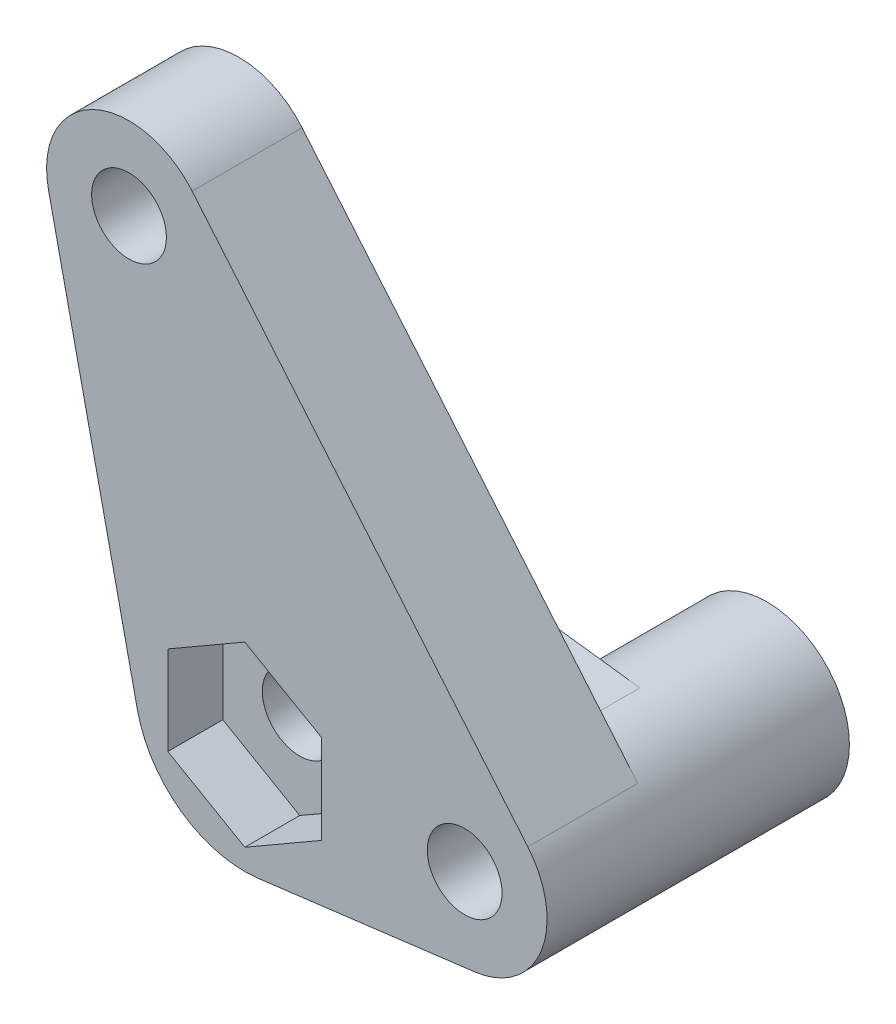
ISO-10303-21;
HEADER;
FILE_DESCRIPTION(('STEP AP214'),'2;1');
FILE_NAME('part.step','',(''),(''),'','','');
FILE_SCHEMA(('AUTOMOTIVE_DESIGN { 1 0 10303 214 1 1 1 1 }'));
ENDSEC;
DATA;
#1=APPLICATION_CONTEXT('core data for automotive mechanical design processes');
#2=APPLICATION_PROTOCOL_DEFINITION('international standard','automotive_design',2000,#1);
#3=PRODUCT_CONTEXT('',#1,'mechanical');
#4=PRODUCT('Part','Part','',(#3));
#5=PRODUCT_RELATED_PRODUCT_CATEGORY('part','',(#4));
#6=PRODUCT_DEFINITION_FORMATION('','',#4);
#7=PRODUCT_DEFINITION_CONTEXT('part definition',#1,'design');
#8=PRODUCT_DEFINITION('design','',#6,#7);
#9=PRODUCT_DEFINITION_SHAPE('','',#8);
#10=(LENGTH_UNIT() NAMED_UNIT(*) SI_UNIT(.MILLI.,.METRE.));
#11=(NAMED_UNIT(*) PLANE_ANGLE_UNIT() SI_UNIT($,.RADIAN.));
#12=(NAMED_UNIT(*) SI_UNIT($,.STERADIAN.) SOLID_ANGLE_UNIT());
#13=UNCERTAINTY_MEASURE_WITH_UNIT(LENGTH_MEASURE(1.E-05),#10,'distance_accuracy_value','');
#14=(GEOMETRIC_REPRESENTATION_CONTEXT(3) GLOBAL_UNCERTAINTY_ASSIGNED_CONTEXT((#13)) GLOBAL_UNIT_ASSIGNED_CONTEXT((#10,
#11,#12)) REPRESENTATION_CONTEXT('',''));
#15=CARTESIAN_POINT('',(0.,0.,0.));
#16=DIRECTION('',(0.,0.,1.));
#17=DIRECTION('',(1.,0.,0.));
#18=AXIS2_PLACEMENT_3D('',#15,#16,#17);
#19=CARTESIAN_POINT('',(0.,0.,-3.175));
#20=DIRECTION('',(0.,0.,-1.));
#21=DIRECTION('',(1.,0.,0.));
#22=AXIS2_PLACEMENT_3D('',#19,#20,#21);
#23=PLANE('',#22);
#24=CARTESIAN_POINT('',(-19.3880812771702,23.1058155155762,-3.175));
#25=DIRECTION('',(0.,0.,1.));
#26=DIRECTION('',(1.,0.,0.));
#27=AXIS2_PLACEMENT_3D('',#24,#25,#26);
#28=CIRCLE('',#27,2.15899999999999);
#29=CARTESIAN_POINT('',(-17.2290812771702,23.1058155155762,-3.175));
#30=VERTEX_POINT('',#29);
#31=EDGE_CURVE('E236',#30,#30,#28,.T.);
#32=ORIENTED_EDGE('',*,*,#31,.T.);
#33=EDGE_LOOP('',(#32));
#34=FACE_BOUND('',#33,.T.);
#35=DIRECTION('',(0.214040632784061,-0.976824757833972,0.));
#36=VECTOR('',#35,1.);
#37=CARTESIAN_POINT('',(-24.0402091863545,22.0864470019421,-3.175));
#38=LINE('',#37,#36);
#39=CARTESIAN_POINT('',(-24.0402091863545,22.0864470019421,-3.175));
#40=VERTEX_POINT('',#39);
#41=CARTESIAN_POINT('',(-18.9028372122457,-1.35915801817878,-3.175));
#42=VERTEX_POINT('',#41);
#43=EDGE_CURVE('E248',#40,#42,#38,.T.);
#44=ORIENTED_EDGE('',*,*,#43,.F.);
#45=CARTESIAN_POINT('',(-19.3880812771702,23.1058155155762,-3.175));
#46=DIRECTION('',(0.,0.,1.));
#47=DIRECTION('',(1.,0.,0.));
#48=AXIS2_PLACEMENT_3D('',#45,#46,#47);
#49=CIRCLE('',#48,4.76250000000001);
#50=CARTESIAN_POINT('',(-15.739794616816,26.1670915067084,-3.175));
#51=VERTEX_POINT('',#50);
#52=EDGE_CURVE('E245',#51,#40,#49,.T.);
#53=ORIENTED_EDGE('',*,*,#52,.F.);
#54=DIRECTION('',(-0.642787609686538,0.76604444311898,0.));
#55=VECTOR('',#54,1.);
#56=CARTESIAN_POINT('',(3.64828666035414,3.06127599113214,-3.175));
#57=LINE('',#56,#55);
#58=CARTESIAN_POINT('',(3.64828666035414,3.06127599113214,-3.175));
#59=VERTEX_POINT('',#58);
#60=EDGE_CURVE('E242',#59,#51,#57,.T.);
#61=ORIENTED_EDGE('',*,*,#60,.F.);
#62=CARTESIAN_POINT('',(0.,0.,-3.175));
#63=DIRECTION('',(0.,0.,1.));
#64=DIRECTION('',(1.,0.,0.));
#65=AXIS2_PLACEMENT_3D('',#62,#63,#64);
#66=CIRCLE('',#65,4.7625);
#67=CARTESIAN_POINT('',(0.595312499999999,4.72514648210442,-3.175));
#68=VERTEX_POINT('',#67);
#69=EDGE_CURVE('E226',#59,#68,#66,.T.);
#70=ORIENTED_EDGE('',*,*,#69,.T.);
#71=DIRECTION('',(-0.992156741649221,0.125,0.));
#72=VECTOR('',#71,1.);
#73=CARTESIAN_POINT('',(-11.90625,6.30019530947255,-3.175));
#74=LINE('',#73,#72);
#75=CARTESIAN_POINT('',(-11.90625,6.30019530947255,-3.175));
#76=VERTEX_POINT('',#75);
#77=EDGE_CURVE('E164',#68,#76,#74,.T.);
#78=ORIENTED_EDGE('',*,*,#77,.T.);
#79=CARTESIAN_POINT('',(-12.7,0.,-3.175));
#80=DIRECTION('',(0.,0.,1.));
#81=DIRECTION('',(1.,0.,0.));
#82=AXIS2_PLACEMENT_3D('',#79,#80,#81);
#83=CIRCLE('',#82,6.35);
#84=EDGE_CURVE('E167',#76,#42,#83,.T.);
#85=ORIENTED_EDGE('',*,*,#84,.T.);
#86=EDGE_LOOP('',(#44,#53,#61,#70,#78,#85));
#87=FACE_BOUND('',#86,.T.);
#88=ADVANCED_FACE('F43',(#34,#87),#23,.T.);
#89=CARTESIAN_POINT('',(-12.7,0.,-3.175));
#90=DIRECTION('',(0.,0.,1.));
#91=DIRECTION('',(-1.,0.,0.));
#92=AXIS2_PLACEMENT_3D('',#89,#90,#91);
#93=CYLINDRICAL_SURFACE('',#92,2.159);
#94=CARTESIAN_POINT('',(-12.7,0.,0.));
#95=DIRECTION('',(0.,0.,-1.));
#96=DIRECTION('',(-1.,0.,0.));
#97=AXIS2_PLACEMENT_3D('',#94,#95,#96);
#98=CIRCLE('',#97,2.159);
#99=CARTESIAN_POINT('',(-14.859,0.,0.));
#100=VERTEX_POINT('',#99);
#101=EDGE_CURVE('E47',#100,#100,#98,.T.);
#102=ORIENTED_EDGE('',*,*,#101,.F.);
#103=EDGE_LOOP('',(#102));
#104=FACE_BOUND('',#103,.T.);
#105=CARTESIAN_POINT('',(-12.7,0.,-6.35));
#106=DIRECTION('',(0.,0.,1.));
#107=DIRECTION('',(1.,0.,0.));
#108=AXIS2_PLACEMENT_3D('',#105,#106,#107);
#109=CIRCLE('',#108,2.159);
#110=CARTESIAN_POINT('',(-10.541,0.,-6.35));
#111=VERTEX_POINT('',#110);
#112=EDGE_CURVE('E170',#111,#111,#109,.T.);
#113=ORIENTED_EDGE('',*,*,#112,.F.);
#114=EDGE_LOOP('',(#113));
#115=FACE_BOUND('',#114,.T.);
#116=ADVANCED_FACE('F300',(#104,#115),#93,.F.);
#117=CARTESIAN_POINT('',(0.,0.,3.175));
#118=DIRECTION('',(0.,0.,-1.));
#119=DIRECTION('',(1.,0.,0.));
#120=AXIS2_PLACEMENT_3D('',#117,#118,#119);
#121=PLANE('',#120);
#122=DIRECTION('',(0.866025403784439,-0.5,0.));
#123=VECTOR('',#122,1.);
#124=CARTESIAN_POINT('',(-12.7,5.13264389309577,3.175));
#125=LINE('',#124,#123);
#126=CARTESIAN_POINT('',(-12.7,5.13264389309577,3.175));
#127=VERTEX_POINT('',#126);
#128=CARTESIAN_POINT('',(-8.255,2.56632194654789,3.175));
#129=VERTEX_POINT('',#128);
#130=EDGE_CURVE('E198',#127,#129,#125,.T.);
#131=ORIENTED_EDGE('',*,*,#130,.T.);
#132=DIRECTION('',(0.,-1.,0.));
#133=VECTOR('',#132,1.);
#134=CARTESIAN_POINT('',(-8.255,2.56632194654789,3.175));
#135=LINE('',#134,#133);
#136=CARTESIAN_POINT('',(-8.255,-2.56632194654789,3.175));
#137=VERTEX_POINT('',#136);
#138=EDGE_CURVE('E201',#129,#137,#135,.T.);
#139=ORIENTED_EDGE('',*,*,#138,.T.);
#140=DIRECTION('',(-0.866025403784439,-0.5,0.));
#141=VECTOR('',#140,1.);
#142=CARTESIAN_POINT('',(-8.255,-2.56632194654789,3.175));
#143=LINE('',#142,#141);
#144=CARTESIAN_POINT('',(-12.7,-5.13264389309577,3.175));
#145=VERTEX_POINT('',#144);
#146=EDGE_CURVE('E204',#137,#145,#143,.T.);
#147=ORIENTED_EDGE('',*,*,#146,.T.);
#148=DIRECTION('',(-0.866025403784439,0.5,0.));
#149=VECTOR('',#148,1.);
#150=CARTESIAN_POINT('',(-12.7,-5.13264389309577,3.175));
#151=LINE('',#150,#149);
#152=CARTESIAN_POINT('',(-17.145,-2.56632194654789,3.175));
#153=VERTEX_POINT('',#152);
#154=EDGE_CURVE('E207',#145,#153,#151,.T.);
#155=ORIENTED_EDGE('',*,*,#154,.T.);
#156=DIRECTION('',(0.,1.,0.));
#157=VECTOR('',#156,1.);
#158=CARTESIAN_POINT('',(-17.145,-2.56632194654789,3.175));
#159=LINE('',#158,#157);
#160=CARTESIAN_POINT('',(-17.145,2.56632194654789,3.175));
#161=VERTEX_POINT('',#160);
#162=EDGE_CURVE('E185',#153,#161,#159,.T.);
#163=ORIENTED_EDGE('',*,*,#162,.T.);
#164=DIRECTION('',(0.866025403784439,0.5,0.));
#165=VECTOR('',#164,1.);
#166=CARTESIAN_POINT('',(-17.145,2.56632194654789,3.175));
#167=LINE('',#166,#165);
#168=EDGE_CURVE('E180',#161,#127,#167,.T.);
#169=ORIENTED_EDGE('',*,*,#168,.T.);
#170=EDGE_LOOP('',(#131,#139,#147,#155,#163,#169));
#171=FACE_BOUND('',#170,.T.);
#172=CARTESIAN_POINT('',(0.,0.,3.175));
#173=DIRECTION('',(0.,0.,1.));
#174=DIRECTION('',(1.,0.,0.));
#175=AXIS2_PLACEMENT_3D('',#172,#173,#174);
#176=CIRCLE('',#175,4.7625);
#177=CARTESIAN_POINT('',(0.5953125,-4.72514648210441,3.175));
#178=VERTEX_POINT('',#177);
#179=CARTESIAN_POINT('',(3.64828666035414,3.06127599113214,3.175));
#180=VERTEX_POINT('',#179);
#181=EDGE_CURVE('E239',#178,#180,#176,.T.);
#182=ORIENTED_EDGE('',*,*,#181,.T.);
#183=DIRECTION('',(-0.642787609686538,0.76604444311898,0.));
#184=VECTOR('',#183,1.);
#185=CARTESIAN_POINT('',(3.64828666035414,3.06127599113214,3.175));
#186=LINE('',#185,#184);
#187=CARTESIAN_POINT('',(-15.739794616816,26.1670915067084,3.175));
#188=VERTEX_POINT('',#187);
#189=EDGE_CURVE('E253',#180,#188,#186,.T.);
#190=ORIENTED_EDGE('',*,*,#189,.T.);
#191=CARTESIAN_POINT('',(-19.3880812771702,23.1058155155762,3.175));
#192=DIRECTION('',(0.,0.,1.));
#193=DIRECTION('',(1.,0.,0.));
#194=AXIS2_PLACEMENT_3D('',#191,#192,#193);
#195=CIRCLE('',#194,4.76250000000001);
#196=CARTESIAN_POINT('',(-24.0402091863545,22.0864470019421,3.175));
#197=VERTEX_POINT('',#196);
#198=EDGE_CURVE('E256',#188,#197,#195,.T.);
#199=ORIENTED_EDGE('',*,*,#198,.T.);
#200=DIRECTION('',(0.214040632784061,-0.976824757833972,0.));
#201=VECTOR('',#200,1.);
#202=CARTESIAN_POINT('',(-24.0402091863545,22.0864470019421,3.175));
#203=LINE('',#202,#201);
#204=CARTESIAN_POINT('',(-18.9028372122457,-1.35915801817878,3.175));
#205=VERTEX_POINT('',#204);
#206=EDGE_CURVE('E259',#197,#205,#203,.T.);
#207=ORIENTED_EDGE('',*,*,#206,.T.);
#208=CARTESIAN_POINT('',(-12.7,0.,3.175));
#209=DIRECTION('',(0.,0.,1.));
#210=DIRECTION('',(1.,0.,0.));
#211=AXIS2_PLACEMENT_3D('',#208,#209,#210);
#212=CIRCLE('',#211,6.35);
#213=CARTESIAN_POINT('',(-11.90625,-6.30019530947255,3.175));
#214=VERTEX_POINT('',#213);
#215=EDGE_CURVE('E262',#205,#214,#212,.T.);
#216=ORIENTED_EDGE('',*,*,#215,.T.);
#217=DIRECTION('',(0.992156741649222,0.125,0.));
#218=VECTOR('',#217,1.);
#219=CARTESIAN_POINT('',(0.5953125,-4.72514648210441,3.175));
#220=LINE('',#219,#218);
#221=EDGE_CURVE('E156',#214,#178,#220,.T.);
#222=ORIENTED_EDGE('',*,*,#221,.T.);
#223=EDGE_LOOP('',(#182,#190,#199,#207,#216,#222));
#224=FACE_BOUND('',#223,.T.);
#225=CARTESIAN_POINT('',(-19.3880812771702,23.1058155155762,3.175));
#226=DIRECTION('',(0.,0.,1.));
#227=DIRECTION('',(1.,0.,0.));
#228=AXIS2_PLACEMENT_3D('',#225,#226,#227);
#229=CIRCLE('',#228,2.15899999999999);
#230=CARTESIAN_POINT('',(-17.2290812771702,23.1058155155762,3.175));
#231=VERTEX_POINT('',#230);
#232=EDGE_CURVE('E235',#231,#231,#229,.T.);
#233=ORIENTED_EDGE('',*,*,#232,.F.);
#234=EDGE_LOOP('',(#233));
#235=FACE_BOUND('',#234,.T.);
#236=CARTESIAN_POINT('',(0.,0.,3.175));
#237=DIRECTION('',(0.,0.,1.));
#238=DIRECTION('',(1.,0.,0.));
#239=AXIS2_PLACEMENT_3D('',#236,#237,#238);
#240=CIRCLE('',#239,2.159);
#241=CARTESIAN_POINT('',(2.159,0.,3.175));
#242=VERTEX_POINT('',#241);
#243=EDGE_CURVE('E230',#242,#242,#240,.T.);
#244=ORIENTED_EDGE('',*,*,#243,.F.);
#245=EDGE_LOOP('',(#244));
#246=FACE_BOUND('',#245,.T.);
#247=ADVANCED_FACE('F279',(#171,#224,#235,#246),#121,.F.);
#248=CARTESIAN_POINT('',(0.,0.,-3.175));
#249=DIRECTION('',(0.,0.,1.));
#250=DIRECTION('',(-1.,0.,0.));
#251=AXIS2_PLACEMENT_3D('',#248,#249,#250);
#252=CYLINDRICAL_SURFACE('',#251,4.7625);
#253=CARTESIAN_POINT('',(0.,0.,-6.35));
#254=DIRECTION('',(0.,0.,-1.));
#255=DIRECTION('',(1.,0.,0.));
#256=AXIS2_PLACEMENT_3D('',#253,#254,#255);
#257=CIRCLE('',#256,4.7625);
#258=CARTESIAN_POINT('',(0.5953125,-4.72514648210441,-6.35));
#259=VERTEX_POINT('',#258);
#260=CARTESIAN_POINT('',(0.595312499999999,4.72514648210442,-6.35));
#261=VERTEX_POINT('',#260);
#262=EDGE_CURVE('E150',#259,#261,#257,.T.);
#263=ORIENTED_EDGE('',*,*,#262,.T.);
#264=DIRECTION('',(0.,0.,1.));
#265=VECTOR('',#264,1.);
#266=CARTESIAN_POINT('',(0.595312499999999,4.72514648210442,-6.35));
#267=LINE('',#266,#265);
#268=EDGE_CURVE('E178',#261,#68,#267,.T.);
#269=ORIENTED_EDGE('',*,*,#268,.T.);
#270=ORIENTED_EDGE('',*,*,#69,.F.);
#271=DIRECTION('',(0.,0.,1.));
#272=VECTOR('',#271,1.);
#273=CARTESIAN_POINT('',(3.64828666035414,3.06127599113214,-3.175));
#274=LINE('',#273,#272);
#275=EDGE_CURVE('E11',#59,#180,#274,.T.);
#276=ORIENTED_EDGE('',*,*,#275,.T.);
#277=ORIENTED_EDGE('',*,*,#181,.F.);
#278=DIRECTION('',(0.,0.,1.));
#279=VECTOR('',#278,1.);
#280=CARTESIAN_POINT('',(0.5953125,-4.72514648210441,-3.175));
#281=LINE('',#280,#279);
#282=EDGE_CURVE('E161',#259,#178,#281,.T.);
#283=ORIENTED_EDGE('',*,*,#282,.F.);
#284=EDGE_LOOP('',(#263,#269,#270,#276,#277,#283));
#285=FACE_BOUND('',#284,.T.);
#286=CARTESIAN_POINT('',(0.,0.,-14.2875));
#287=DIRECTION('',(0.,0.,1.));
#288=DIRECTION('',(1.,0.,0.));
#289=AXIS2_PLACEMENT_3D('',#286,#287,#288);
#290=CIRCLE('',#289,4.7625);
#291=CARTESIAN_POINT('',(4.7625,0.,-14.2875));
#292=VERTEX_POINT('',#291);
#293=EDGE_CURVE('E227',#292,#292,#290,.T.);
#294=ORIENTED_EDGE('',*,*,#293,.T.);
#295=EDGE_LOOP('',(#294));
#296=FACE_BOUND('',#295,.T.);
#297=ADVANCED_FACE('F45',(#285,#296),#252,.T.);
#298=CARTESIAN_POINT('',(3.64828666035414,3.06127599113214,-3.175));
#299=DIRECTION('',(-0.766044443118979,-0.642787609686538,0.));
#300=DIRECTION('',(0.642787609686538,-0.766044443118979,0.));
#301=AXIS2_PLACEMENT_3D('',#298,#299,#300);
#302=PLANE('',#301);
#303=ORIENTED_EDGE('',*,*,#189,.F.);
#304=ORIENTED_EDGE('',*,*,#275,.F.);
#305=ORIENTED_EDGE('',*,*,#60,.T.);
#306=DIRECTION('',(0.,0.,1.));
#307=VECTOR('',#306,1.);
#308=CARTESIAN_POINT('',(-15.739794616816,26.1670915067084,-3.175));
#309=LINE('',#308,#307);
#310=EDGE_CURVE('E52',#51,#188,#309,.T.);
#311=ORIENTED_EDGE('',*,*,#310,.T.);
#312=EDGE_LOOP('',(#303,#304,#305,#311));
#313=FACE_BOUND('',#312,.T.);
#314=ADVANCED_FACE('F272',(#313),#302,.F.);
#315=CARTESIAN_POINT('',(-19.3880812771702,23.1058155155762,-3.175));
#316=DIRECTION('',(0.,0.,1.));
#317=DIRECTION('',(-1.,0.,0.));
#318=AXIS2_PLACEMENT_3D('',#315,#316,#317);
#319=CYLINDRICAL_SURFACE('',#318,4.76250000000001);
#320=ORIENTED_EDGE('',*,*,#198,.F.);
#321=ORIENTED_EDGE('',*,*,#310,.F.);
#322=ORIENTED_EDGE('',*,*,#52,.T.);
#323=DIRECTION('',(0.,0.,1.));
#324=VECTOR('',#323,1.);
#325=CARTESIAN_POINT('',(-24.0402091863545,22.0864470019421,-3.175));
#326=LINE('',#325,#324);
#327=EDGE_CURVE('E267',#40,#197,#326,.T.);
#328=ORIENTED_EDGE('',*,*,#327,.T.);
#329=EDGE_LOOP('',(#320,#321,#322,#328));
#330=FACE_BOUND('',#329,.T.);
#331=ADVANCED_FACE('F276',(#330),#319,.T.);
#332=CARTESIAN_POINT('',(-24.0402091863545,22.0864470019421,-3.175));
#333=DIRECTION('',(0.976824757833972,0.214040632784061,0.));
#334=DIRECTION('',(-0.214040632784061,0.976824757833972,0.));
#335=AXIS2_PLACEMENT_3D('',#332,#333,#334);
#336=PLANE('',#335);
#337=ORIENTED_EDGE('',*,*,#206,.F.);
#338=ORIENTED_EDGE('',*,*,#327,.F.);
#339=ORIENTED_EDGE('',*,*,#43,.T.);
#340=DIRECTION('',(0.,0.,1.));
#341=VECTOR('',#340,1.);
#342=CARTESIAN_POINT('',(-18.9028372122457,-1.35915801817878,-3.175));
#343=LINE('',#342,#341);
#344=EDGE_CURVE('E160',#42,#205,#343,.T.);
#345=ORIENTED_EDGE('',*,*,#344,.T.);
#346=EDGE_LOOP('',(#337,#338,#339,#345));
#347=FACE_BOUND('',#346,.T.);
#348=ADVANCED_FACE('F289',(#347),#336,.F.);
#349=CARTESIAN_POINT('',(-12.7,0.,-3.175));
#350=DIRECTION('',(0.,0.,1.));
#351=DIRECTION('',(-1.,0.,0.));
#352=AXIS2_PLACEMENT_3D('',#349,#350,#351);
#353=CYLINDRICAL_SURFACE('',#352,6.35);
#354=ORIENTED_EDGE('',*,*,#215,.F.);
#355=ORIENTED_EDGE('',*,*,#344,.F.);
#356=ORIENTED_EDGE('',*,*,#84,.F.);
#357=DIRECTION('',(0.,0.,1.));
#358=VECTOR('',#357,1.);
#359=CARTESIAN_POINT('',(-11.90625,6.30019530947255,-6.35));
#360=LINE('',#359,#358);
#361=CARTESIAN_POINT('',(-11.90625,6.30019530947255,-6.35));
#362=VERTEX_POINT('',#361);
#363=EDGE_CURVE('E59',#362,#76,#360,.T.);
#364=ORIENTED_EDGE('',*,*,#363,.F.);
#365=CARTESIAN_POINT('',(-12.7,0.,-6.35));
#366=DIRECTION('',(0.,0.,1.));
#367=DIRECTION('',(1.,0.,0.));
#368=AXIS2_PLACEMENT_3D('',#365,#366,#367);
#369=CIRCLE('',#368,6.35);
#370=CARTESIAN_POINT('',(-11.90625,-6.30019530947255,-6.35));
#371=VERTEX_POINT('',#370);
#372=EDGE_CURVE('E148',#362,#371,#369,.T.);
#373=ORIENTED_EDGE('',*,*,#372,.T.);
#374=DIRECTION('',(0.,0.,1.));
#375=VECTOR('',#374,1.);
#376=CARTESIAN_POINT('',(-11.90625,-6.30019530947255,-3.175));
#377=LINE('',#376,#375);
#378=EDGE_CURVE('E153',#371,#214,#377,.T.);
#379=ORIENTED_EDGE('',*,*,#378,.T.);
#380=EDGE_LOOP('',(#354,#355,#356,#364,#373,#379));
#381=FACE_BOUND('',#380,.T.);
#382=ADVANCED_FACE('F163',(#381),#353,.T.);
#383=CARTESIAN_POINT('',(0.5953125,-4.72514648210441,-3.175));
#384=DIRECTION('',(-0.125,0.992156741649221,0.));
#385=DIRECTION('',(-0.992156741649222,-0.125,0.));
#386=AXIS2_PLACEMENT_3D('',#383,#384,#385);
#387=PLANE('',#386);
#388=ORIENTED_EDGE('',*,*,#221,.F.);
#389=ORIENTED_EDGE('',*,*,#378,.F.);
#390=DIRECTION('',(0.992156741649222,0.125,0.));
#391=VECTOR('',#390,1.);
#392=CARTESIAN_POINT('',(-11.90625,-6.30019530947255,-6.35));
#393=LINE('',#392,#391);
#394=EDGE_CURVE('E67',#371,#259,#393,.T.);
#395=ORIENTED_EDGE('',*,*,#394,.T.);
#396=ORIENTED_EDGE('',*,*,#282,.T.);
#397=EDGE_LOOP('',(#388,#389,#395,#396));
#398=FACE_BOUND('',#397,.T.);
#399=ADVANCED_FACE('F154',(#398),#387,.F.);
#400=CARTESIAN_POINT('',(-19.3880812771702,23.1058155155762,-3.175));
#401=DIRECTION('',(0.,0.,1.));
#402=DIRECTION('',(-1.,0.,0.));
#403=AXIS2_PLACEMENT_3D('',#400,#401,#402);
#404=CYLINDRICAL_SURFACE('',#403,2.15899999999999);
#405=ORIENTED_EDGE('',*,*,#31,.F.);
#406=EDGE_LOOP('',(#405));
#407=FACE_BOUND('',#406,.T.);
#408=ORIENTED_EDGE('',*,*,#232,.T.);
#409=EDGE_LOOP('',(#408));
#410=FACE_BOUND('',#409,.T.);
#411=ADVANCED_FACE('F315',(#407,#410),#404,.F.);
#412=CARTESIAN_POINT('',(0.,0.,-3.175));
#413=DIRECTION('',(0.,0.,1.));
#414=DIRECTION('',(-1.,0.,0.));
#415=AXIS2_PLACEMENT_3D('',#412,#413,#414);
#416=CYLINDRICAL_SURFACE('',#415,2.159);
#417=ORIENTED_EDGE('',*,*,#243,.T.);
#418=EDGE_LOOP('',(#417));
#419=FACE_BOUND('',#418,.T.);
#420=CARTESIAN_POINT('',(0.,0.,-14.2875));
#421=DIRECTION('',(0.,0.,1.));
#422=DIRECTION('',(1.,0.,0.));
#423=AXIS2_PLACEMENT_3D('',#420,#421,#422);
#424=CIRCLE('',#423,2.159);
#425=CARTESIAN_POINT('',(2.159,0.,-14.2875));
#426=VERTEX_POINT('',#425);
#427=EDGE_CURVE('E223',#426,#426,#424,.T.);
#428=ORIENTED_EDGE('',*,*,#427,.F.);
#429=EDGE_LOOP('',(#428));
#430=FACE_BOUND('',#429,.T.);
#431=ADVANCED_FACE('F393',(#419,#430),#416,.F.);
#432=CARTESIAN_POINT('',(0.,0.,-14.2875));
#433=DIRECTION('',(0.,0.,-1.));
#434=DIRECTION('',(1.,0.,0.));
#435=AXIS2_PLACEMENT_3D('',#432,#433,#434);
#436=PLANE('',#435);
#437=ORIENTED_EDGE('',*,*,#293,.F.);
#438=EDGE_LOOP('',(#437));
#439=FACE_BOUND('',#438,.T.);
#440=ORIENTED_EDGE('',*,*,#427,.T.);
#441=EDGE_LOOP('',(#440));
#442=FACE_BOUND('',#441,.T.);
#443=ADVANCED_FACE('F403',(#439,#442),#436,.T.);
#444=CARTESIAN_POINT('',(-17.145,2.56632194654789,0.));
#445=DIRECTION('',(-0.5,0.866025403784439,0.));
#446=DIRECTION('',(-0.866025403784439,-0.5,0.));
#447=AXIS2_PLACEMENT_3D('',#444,#445,#446);
#448=PLANE('',#447);
#449=ORIENTED_EDGE('',*,*,#168,.F.);
#450=DIRECTION('',(0.,0.,1.));
#451=VECTOR('',#450,1.);
#452=CARTESIAN_POINT('',(-17.145,2.56632194654789,0.));
#453=LINE('',#452,#451);
#454=CARTESIAN_POINT('',(-17.145,2.56632194654789,0.));
#455=VERTEX_POINT('',#454);
#456=EDGE_CURVE('E212',#455,#161,#453,.T.);
#457=ORIENTED_EDGE('',*,*,#456,.F.);
#458=DIRECTION('',(0.866025403784439,0.5,0.));
#459=VECTOR('',#458,1.);
#460=CARTESIAN_POINT('',(-17.145,2.56632194654789,0.));
#461=LINE('',#460,#459);
#462=CARTESIAN_POINT('',(-12.7,5.13264389309577,0.));
#463=VERTEX_POINT('',#462);
#464=EDGE_CURVE('E181',#455,#463,#461,.T.);
#465=ORIENTED_EDGE('',*,*,#464,.T.);
#466=DIRECTION('',(0.,0.,1.));
#467=VECTOR('',#466,1.);
#468=CARTESIAN_POINT('',(-12.7,5.13264389309577,0.));
#469=LINE('',#468,#467);
#470=EDGE_CURVE('E195',#463,#127,#469,.T.);
#471=ORIENTED_EDGE('',*,*,#470,.T.);
#472=EDGE_LOOP('',(#449,#457,#465,#471));
#473=FACE_BOUND('',#472,.T.);
#474=ADVANCED_FACE('F417',(#473),#448,.F.);
#475=CARTESIAN_POINT('',(-17.145,-2.56632194654789,0.));
#476=DIRECTION('',(-1.,0.,0.));
#477=DIRECTION('',(0.,0.,-1.));
#478=AXIS2_PLACEMENT_3D('',#475,#476,#477);
#479=PLANE('',#478);
#480=ORIENTED_EDGE('',*,*,#162,.F.);
#481=DIRECTION('',(0.,0.,1.));
#482=VECTOR('',#481,1.);
#483=CARTESIAN_POINT('',(-17.145,-2.56632194654789,0.));
#484=LINE('',#483,#482);
#485=CARTESIAN_POINT('',(-17.145,-2.56632194654789,0.));
#486=VERTEX_POINT('',#485);
#487=EDGE_CURVE('E214',#486,#153,#484,.T.);
#488=ORIENTED_EDGE('',*,*,#487,.F.);
#489=DIRECTION('',(0.,1.,0.));
#490=VECTOR('',#489,1.);
#491=CARTESIAN_POINT('',(-17.145,-2.56632194654789,0.));
#492=LINE('',#491,#490);
#493=EDGE_CURVE('E193',#486,#455,#492,.T.);
#494=ORIENTED_EDGE('',*,*,#493,.T.);
#495=ORIENTED_EDGE('',*,*,#456,.T.);
#496=EDGE_LOOP('',(#480,#488,#494,#495));
#497=FACE_BOUND('',#496,.T.);
#498=ADVANCED_FACE('F427',(#497),#479,.F.);
#499=CARTESIAN_POINT('',(-12.7,-5.13264389309577,0.));
#500=DIRECTION('',(-0.5,-0.866025403784439,0.));
#501=DIRECTION('',(0.866025403784439,-0.5,0.));
#502=AXIS2_PLACEMENT_3D('',#499,#500,#501);
#503=PLANE('',#502);
#504=ORIENTED_EDGE('',*,*,#154,.F.);
#505=DIRECTION('',(0.,0.,1.));
#506=VECTOR('',#505,1.);
#507=CARTESIAN_POINT('',(-12.7,-5.13264389309577,0.));
#508=LINE('',#507,#506);
#509=CARTESIAN_POINT('',(-12.7,-5.13264389309577,0.));
#510=VERTEX_POINT('',#509);
#511=EDGE_CURVE('E216',#510,#145,#508,.T.);
#512=ORIENTED_EDGE('',*,*,#511,.F.);
#513=DIRECTION('',(-0.866025403784439,0.5,0.));
#514=VECTOR('',#513,1.);
#515=CARTESIAN_POINT('',(-12.7,-5.13264389309577,0.));
#516=LINE('',#515,#514);
#517=EDGE_CURVE('E191',#510,#486,#516,.T.);
#518=ORIENTED_EDGE('',*,*,#517,.T.);
#519=ORIENTED_EDGE('',*,*,#487,.T.);
#520=EDGE_LOOP('',(#504,#512,#518,#519));
#521=FACE_BOUND('',#520,.T.);
#522=ADVANCED_FACE('F437',(#521),#503,.F.);
#523=CARTESIAN_POINT('',(-8.255,-2.56632194654789,0.));
#524=DIRECTION('',(0.5,-0.866025403784439,0.));
#525=DIRECTION('',(0.866025403784439,0.5,0.));
#526=AXIS2_PLACEMENT_3D('',#523,#524,#525);
#527=PLANE('',#526);
#528=ORIENTED_EDGE('',*,*,#146,.F.);
#529=DIRECTION('',(0.,0.,1.));
#530=VECTOR('',#529,1.);
#531=CARTESIAN_POINT('',(-8.255,-2.56632194654789,0.));
#532=LINE('',#531,#530);
#533=CARTESIAN_POINT('',(-8.255,-2.56632194654789,0.));
#534=VERTEX_POINT('',#533);
#535=EDGE_CURVE('E218',#534,#137,#532,.T.);
#536=ORIENTED_EDGE('',*,*,#535,.F.);
#537=DIRECTION('',(-0.866025403784439,-0.5,0.));
#538=VECTOR('',#537,1.);
#539=CARTESIAN_POINT('',(-8.255,-2.56632194654789,0.));
#540=LINE('',#539,#538);
#541=EDGE_CURVE('E189',#534,#510,#540,.T.);
#542=ORIENTED_EDGE('',*,*,#541,.T.);
#543=ORIENTED_EDGE('',*,*,#511,.T.);
#544=EDGE_LOOP('',(#528,#536,#542,#543));
#545=FACE_BOUND('',#544,.T.);
#546=ADVANCED_FACE('F447',(#545),#527,.F.);
#547=CARTESIAN_POINT('',(-8.255,2.56632194654789,0.));
#548=DIRECTION('',(1.,0.,0.));
#549=DIRECTION('',(0.,1.,0.));
#550=AXIS2_PLACEMENT_3D('',#547,#548,#549);
#551=PLANE('',#550);
#552=ORIENTED_EDGE('',*,*,#138,.F.);
#553=DIRECTION('',(0.,0.,1.));
#554=VECTOR('',#553,1.);
#555=CARTESIAN_POINT('',(-8.255,2.56632194654789,0.));
#556=LINE('',#555,#554);
#557=CARTESIAN_POINT('',(-8.255,2.56632194654789,0.));
#558=VERTEX_POINT('',#557);
#559=EDGE_CURVE('E220',#558,#129,#556,.T.);
#560=ORIENTED_EDGE('',*,*,#559,.F.);
#561=DIRECTION('',(0.,-1.,0.));
#562=VECTOR('',#561,1.);
#563=CARTESIAN_POINT('',(-8.255,2.56632194654789,0.));
#564=LINE('',#563,#562);
#565=EDGE_CURVE('E187',#558,#534,#564,.T.);
#566=ORIENTED_EDGE('',*,*,#565,.T.);
#567=ORIENTED_EDGE('',*,*,#535,.T.);
#568=EDGE_LOOP('',(#552,#560,#566,#567));
#569=FACE_BOUND('',#568,.T.);
#570=ADVANCED_FACE('F457',(#569),#551,.F.);
#571=CARTESIAN_POINT('',(-12.7,5.13264389309577,0.));
#572=DIRECTION('',(0.5,0.866025403784439,0.));
#573=DIRECTION('',(-0.866025403784439,0.5,0.));
#574=AXIS2_PLACEMENT_3D('',#571,#572,#573);
#575=PLANE('',#574);
#576=ORIENTED_EDGE('',*,*,#130,.F.);
#577=ORIENTED_EDGE('',*,*,#470,.F.);
#578=DIRECTION('',(0.866025403784439,-0.5,0.));
#579=VECTOR('',#578,1.);
#580=CARTESIAN_POINT('',(-12.7,5.13264389309577,0.));
#581=LINE('',#580,#579);
#582=EDGE_CURVE('E184',#463,#558,#581,.T.);
#583=ORIENTED_EDGE('',*,*,#582,.T.);
#584=ORIENTED_EDGE('',*,*,#559,.T.);
#585=EDGE_LOOP('',(#576,#577,#583,#584));
#586=FACE_BOUND('',#585,.T.);
#587=ADVANCED_FACE('F466',(#586),#575,.F.);
#588=CARTESIAN_POINT('',(0.,0.,0.));
#589=DIRECTION('',(0.,0.,1.));
#590=DIRECTION('',(-1.,0.,0.));
#591=AXIS2_PLACEMENT_3D('',#588,#589,#590);
#592=PLANE('',#591);
#593=ORIENTED_EDGE('',*,*,#101,.T.);
#594=EDGE_LOOP('',(#593));
#595=FACE_BOUND('',#594,.T.);
#596=ORIENTED_EDGE('',*,*,#464,.F.);
#597=ORIENTED_EDGE('',*,*,#493,.F.);
#598=ORIENTED_EDGE('',*,*,#517,.F.);
#599=ORIENTED_EDGE('',*,*,#541,.F.);
#600=ORIENTED_EDGE('',*,*,#565,.F.);
#601=ORIENTED_EDGE('',*,*,#582,.F.);
#602=EDGE_LOOP('',(#596,#597,#598,#599,#600,#601));
#603=FACE_BOUND('',#602,.T.);
#604=ADVANCED_FACE('F296',(#595,#603),#592,.T.);
#605=CARTESIAN_POINT('',(-12.7,0.,-6.35));
#606=DIRECTION('',(0.,0.,-1.));
#607=DIRECTION('',(1.,0.,0.));
#608=AXIS2_PLACEMENT_3D('',#605,#606,#607);
#609=PLANE('',#608);
#610=ORIENTED_EDGE('',*,*,#372,.F.);
#611=DIRECTION('',(-0.992156741649221,0.125,0.));
#612=VECTOR('',#611,1.);
#613=CARTESIAN_POINT('',(-11.90625,6.30019530947255,-6.35));
#614=LINE('',#613,#612);
#615=EDGE_CURVE('E173',#261,#362,#614,.T.);
#616=ORIENTED_EDGE('',*,*,#615,.F.);
#617=ORIENTED_EDGE('',*,*,#262,.F.);
#618=ORIENTED_EDGE('',*,*,#394,.F.);
#619=EDGE_LOOP('',(#610,#616,#617,#618));
#620=FACE_BOUND('',#619,.T.);
#621=ORIENTED_EDGE('',*,*,#112,.T.);
#622=EDGE_LOOP('',(#621));
#623=FACE_BOUND('',#622,.T.);
#624=ADVANCED_FACE('F145',(#620,#623),#609,.T.);
#625=CARTESIAN_POINT('',(-11.90625,6.30019530947255,-6.35));
#626=DIRECTION('',(-0.125,-0.992156741649221,0.));
#627=DIRECTION('',(0.992156741649222,-0.125,0.));
#628=AXIS2_PLACEMENT_3D('',#625,#626,#627);
#629=PLANE('',#628);
#630=ORIENTED_EDGE('',*,*,#77,.F.);
#631=ORIENTED_EDGE('',*,*,#268,.F.);
#632=ORIENTED_EDGE('',*,*,#615,.T.);
#633=ORIENTED_EDGE('',*,*,#363,.T.);
#634=EDGE_LOOP('',(#630,#631,#632,#633));
#635=FACE_BOUND('',#634,.T.);
#636=ADVANCED_FACE('F290',(#635),#629,.F.);
#637=CLOSED_SHELL('',(#88,#116,#247,#297,#314,#331,#348,#382,#399,#411,#431,#443,#474,#498,#522,
#546,#570,#587,#604,#624,#636));
#638=MANIFOLD_SOLID_BREP('B2',#637);
#639=ADVANCED_BREP_SHAPE_REPRESENTATION('',(#18,#638),#14);
#640=SHAPE_DEFINITION_REPRESENTATION(#9,#639);
ENDSEC;
END-ISO-10303-21;
